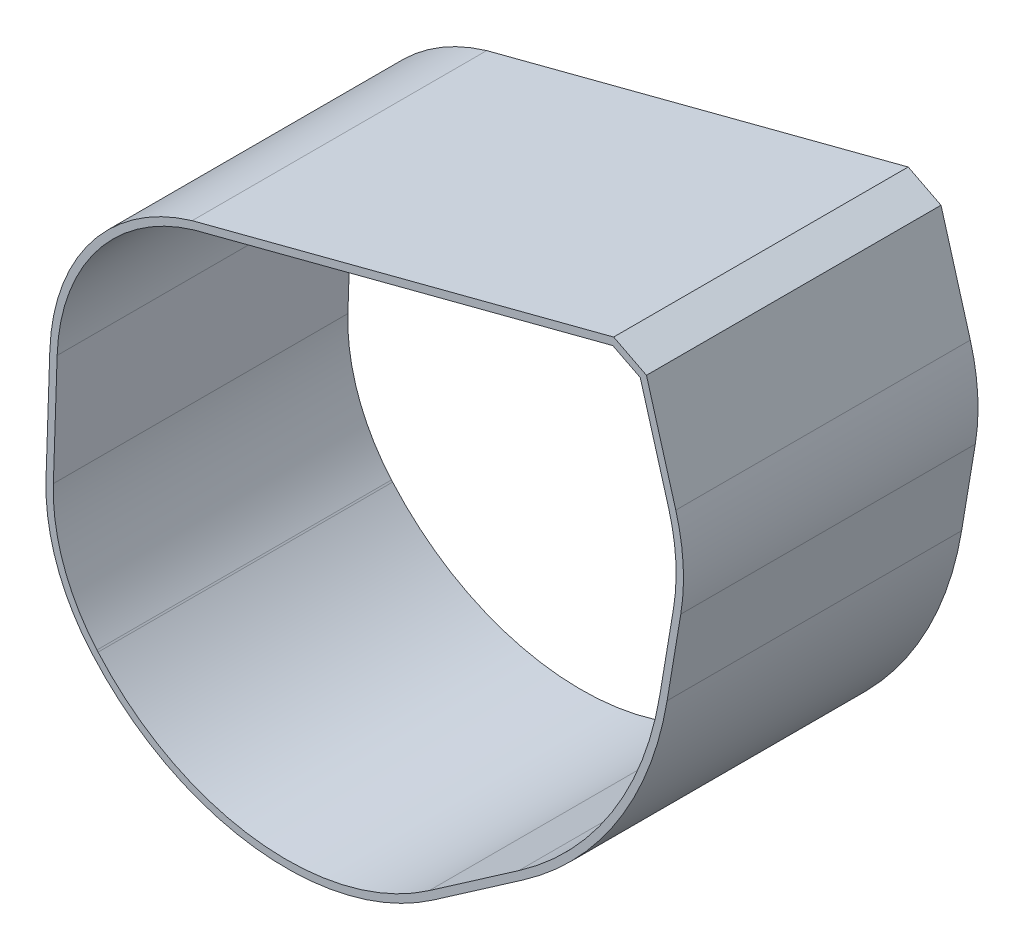
ISO-10303-21;
HEADER;
FILE_DESCRIPTION(('STEP AP214'),'2;1');
FILE_NAME('part.step','',(''),(''),'','','');
FILE_SCHEMA(('AUTOMOTIVE_DESIGN { 1 0 10303 214 1 1 1 1 }'));
ENDSEC;
DATA;
#1=APPLICATION_CONTEXT('core data for automotive mechanical design processes');
#2=APPLICATION_PROTOCOL_DEFINITION('international standard','automotive_design',2000,#1);
#3=PRODUCT_CONTEXT('',#1,'mechanical');
#4=PRODUCT('Part','Part','',(#3));
#5=PRODUCT_RELATED_PRODUCT_CATEGORY('part','',(#4));
#6=PRODUCT_DEFINITION_FORMATION('','',#4);
#7=PRODUCT_DEFINITION_CONTEXT('part definition',#1,'design');
#8=PRODUCT_DEFINITION('design','',#6,#7);
#9=PRODUCT_DEFINITION_SHAPE('','',#8);
#10=(LENGTH_UNIT() NAMED_UNIT(*) SI_UNIT(.MILLI.,.METRE.));
#11=(NAMED_UNIT(*) PLANE_ANGLE_UNIT() SI_UNIT($,.RADIAN.));
#12=(NAMED_UNIT(*) SI_UNIT($,.STERADIAN.) SOLID_ANGLE_UNIT());
#13=UNCERTAINTY_MEASURE_WITH_UNIT(LENGTH_MEASURE(1.E-05),#10,'distance_accuracy_value','');
#14=(GEOMETRIC_REPRESENTATION_CONTEXT(3) GLOBAL_UNCERTAINTY_ASSIGNED_CONTEXT((#13)) GLOBAL_UNIT_ASSIGNED_CONTEXT((#10,
#11,#12)) REPRESENTATION_CONTEXT('',''));
#15=CARTESIAN_POINT('',(0.,0.,0.));
#16=DIRECTION('',(0.,0.,1.));
#17=DIRECTION('',(1.,0.,0.));
#18=AXIS2_PLACEMENT_3D('',#15,#16,#17);
#19=CARTESIAN_POINT('',(71.229054664981,195.352203738938,101.6));
#20=DIRECTION('',(0.,0.,1.));
#21=DIRECTION('',(1.,0.,0.));
#22=AXIS2_PLACEMENT_3D('',#19,#20,#21);
#23=PLANE('',#22);
#24=CARTESIAN_POINT('',(71.229054664981,195.352203738938,101.6));
#25=DIRECTION('',(0.,0.,1.));
#26=DIRECTION('',(1.,0.,0.));
#27=AXIS2_PLACEMENT_3D('',#24,#25,#26);
#28=CIRCLE('',#27,68.58);
#29=CARTESIAN_POINT('',(51.7996605549198,261.122372086875,101.6));
#30=VERTEX_POINT('',#29);
#31=CARTESIAN_POINT('',(2.68786865894482,197.659197645725,101.6));
#32=VERTEX_POINT('',#31);
#33=EDGE_CURVE('E290',#30,#32,#28,.T.);
#34=ORIENTED_EDGE('',*,*,#33,.T.);
#35=DIRECTION('',(-0.0336394562086104,-0.999434033333861,0.));
#36=VECTOR('',#35,1.);
#37=CARTESIAN_POINT('',(1.37677554533085,158.706395600129,101.6));
#38=LINE('',#37,#36);
#39=CARTESIAN_POINT('',(1.37677554533083,158.706395600129,101.6));
#40=VERTEX_POINT('',#39);
#41=EDGE_CURVE('E293',#32,#40,#38,.T.);
#42=ORIENTED_EDGE('',*,*,#41,.T.);
#43=CARTESIAN_POINT('',(64.840836662031,156.570290130882,101.6));
#44=DIRECTION('',(0.,0.,1.));
#45=DIRECTION('',(-1.,0.,0.));
#46=AXIS2_PLACEMENT_3D('',#43,#44,#45);
#47=CIRCLE('',#46,63.5);
#48=CARTESIAN_POINT('',(17.0366550230462,114.773038811843,101.6));
#49=VERTEX_POINT('',#48);
#50=EDGE_CURVE('E296',#40,#49,#47,.T.);
#51=ORIENTED_EDGE('',*,*,#50,.T.);
#52=DIRECTION('',(0.658224430221118,-0.752821758094228,0.));
#53=VECTOR('',#52,1.);
#54=CARTESIAN_POINT('',(17.4314207231345,114.321538996991,101.6));
#55=LINE('',#54,#53);
#56=CARTESIAN_POINT('',(17.4314207231345,114.321538996991,101.6));
#57=VERTEX_POINT('',#56);
#58=EDGE_CURVE('E298',#49,#57,#55,.T.);
#59=ORIENTED_EDGE('',*,*,#58,.T.);
#60=CARTESIAN_POINT('',(84.3572750177134,172.837690843646,101.6));
#61=DIRECTION('',(0.,0.,1.));
#62=DIRECTION('',(-1.,0.,0.));
#63=AXIS2_PLACEMENT_3D('',#60,#61,#62);
#64=CIRCLE('',#63,88.9);
#65=CARTESIAN_POINT('',(135.007693070529,99.7778171024811,101.6));
#66=VERTEX_POINT('',#65);
#67=EDGE_CURVE('E300',#57,#66,#64,.T.);
#68=ORIENTED_EDGE('',*,*,#67,.T.);
#69=DIRECTION('',(0.821820851981611,0.569745984846071,0.));
#70=VECTOR('',#69,1.);
#71=CARTESIAN_POINT('',(165.895883474715,121.191757159504,101.6));
#72=LINE('',#71,#70);
#73=CARTESIAN_POINT('',(165.895883474715,121.191757159504,101.6));
#74=VERTEX_POINT('',#73);
#75=EDGE_CURVE('E302',#66,#74,#72,.T.);
#76=ORIENTED_EDGE('',*,*,#75,.T.);
#77=CARTESIAN_POINT('',(97.8796078037908,219.300730469069,101.6));
#78=DIRECTION('',(0.,0.,1.));
#79=DIRECTION('',(-1.,0.,0.));
#80=AXIS2_PLACEMENT_3D('',#77,#78,#79);
#81=CIRCLE('',#80,119.38);
#82=CARTESIAN_POINT('',(215.625776200021,199.617635488689,101.6));
#83=VERTEX_POINT('',#82);
#84=EDGE_CURVE('E304',#74,#83,#81,.T.);
#85=ORIENTED_EDGE('',*,*,#84,.T.);
#86=DIRECTION('',(0.164877659410121,0.986314025768386,0.));
#87=VECTOR('',#86,1.);
#88=CARTESIAN_POINT('',(220.342179316499,227.831612819533,101.6));
#89=LINE('',#88,#87);
#90=CARTESIAN_POINT('',(220.342179316499,227.831612819533,101.6));
#91=VERTEX_POINT('',#90);
#92=EDGE_CURVE('E306',#83,#91,#89,.T.);
#93=ORIENTED_EDGE('',*,*,#92,.T.);
#94=CARTESIAN_POINT('',(152.700763429303,239.138922701879,101.6));
#95=DIRECTION('',(0.,0.,1.));
#96=DIRECTION('',(-1.,0.,0.));
#97=AXIS2_PLACEMENT_3D('',#94,#95,#96);
#98=CIRCLE('',#97,68.58);
#99=CARTESIAN_POINT('',(218.620076974412,258.056123915102,101.6));
#100=VERTEX_POINT('',#99);
#101=EDGE_CURVE('E308',#91,#100,#98,.T.);
#102=ORIENTED_EDGE('',*,*,#101,.T.);
#103=DIRECTION('',(-0.275841370854804,0.96120317213633,0.));
#104=VECTOR('',#103,1.);
#105=CARTESIAN_POINT('',(208.509660321781,293.287113842441,101.6));
#106=LINE('',#105,#104);
#107=CARTESIAN_POINT('',(208.509660321781,293.287113842441,101.6));
#108=VERTEX_POINT('',#107);
#109=EDGE_CURVE('E310',#100,#108,#106,.T.);
#110=ORIENTED_EDGE('',*,*,#109,.T.);
#111=DIRECTION('',(-0.891406266207597,0.453205106508995,0.));
#112=VECTOR('',#111,1.);
#113=CARTESIAN_POINT('',(197.186615042477,299.043929938928,101.6));
#114=LINE('',#113,#112);
#115=CARTESIAN_POINT('',(197.186615042477,299.043929938928,101.6));
#116=VERTEX_POINT('',#115);
#117=EDGE_CURVE('E312',#108,#116,#114,.T.);
#118=ORIENTED_EDGE('',*,*,#117,.T.);
#119=DIRECTION('',(-0.967626169911023,-0.2523877875479,0.));
#120=VECTOR('',#119,1.);
#121=CARTESIAN_POINT('',(51.7996605549198,261.122372086875,101.6));
#122=LINE('',#121,#120);
#123=EDGE_CURVE('E314',#116,#30,#122,.T.);
#124=ORIENTED_EDGE('',*,*,#123,.T.);
#125=EDGE_LOOP('',(#34,#42,#51,#59,#68,#76,#85,#93,#102,#110,#118,#124));
#126=FACE_BOUND('',#125,.T.);
#127=DIRECTION('',(-0.967626169911023,-0.2523877875479,0.));
#128=VECTOR('',#127,1.);
#129=CARTESIAN_POINT('',(52.4805441545708,258.674987582046,101.6));
#130=LINE('',#129,#128);
#131=CARTESIAN_POINT('',(196.894837030832,296.342844242729,101.6));
#132=VERTEX_POINT('',#131);
#133=CARTESIAN_POINT('',(52.4805441545708,258.674987582046,101.6));
#134=VERTEX_POINT('',#133);
#135=EDGE_CURVE('E205',#132,#134,#130,.T.);
#136=ORIENTED_EDGE('',*,*,#135,.F.);
#137=DIRECTION('',(-0.891406266207596,0.453205106508998,0.));
#138=VECTOR('',#137,1.);
#139=CARTESIAN_POINT('',(196.894837030832,296.342844242729,101.6));
#140=LINE('',#139,#138);
#141=CARTESIAN_POINT('',(206.373128661955,291.523930206505,101.6));
#142=VERTEX_POINT('',#141);
#143=EDGE_CURVE('E197',#142,#132,#140,.T.);
#144=ORIENTED_EDGE('',*,*,#143,.F.);
#145=DIRECTION('',(-0.275841370854804,0.961203172136329,0.));
#146=VECTOR('',#145,1.);
#147=CARTESIAN_POINT('',(206.373128661955,291.523930206505,101.6));
#148=LINE('',#147,#146);
#149=CARTESIAN_POINT('',(216.178620917186,257.355486833131,101.6));
#150=VERTEX_POINT('',#149);
#151=EDGE_CURVE('E238',#150,#142,#148,.T.);
#152=ORIENTED_EDGE('',*,*,#151,.F.);
#153=CARTESIAN_POINT('',(152.700763429303,239.138922701879,101.6));
#154=DIRECTION('',(0.,0.,1.));
#155=DIRECTION('',(-1.,0.,0.));
#156=AXIS2_PLACEMENT_3D('',#153,#154,#155);
#157=CIRCLE('',#156,66.04);
#158=CARTESIAN_POINT('',(217.836941691047,228.250402074435,101.6));
#159=VERTEX_POINT('',#158);
#160=EDGE_CURVE('E236',#159,#150,#157,.T.);
#161=ORIENTED_EDGE('',*,*,#160,.F.);
#162=DIRECTION('',(0.164877659410121,0.986314025768386,0.));
#163=VECTOR('',#162,1.);
#164=CARTESIAN_POINT('',(217.836941691047,228.250402074435,101.6));
#165=LINE('',#164,#163);
#166=CARTESIAN_POINT('',(213.120538574569,200.036424743591,101.6));
#167=VERTEX_POINT('',#166);
#168=EDGE_CURVE('E234',#167,#159,#165,.T.);
#169=ORIENTED_EDGE('',*,*,#168,.F.);
#170=CARTESIAN_POINT('',(97.8796078037908,219.300730469069,101.6));
#171=DIRECTION('',(0.,0.,1.));
#172=DIRECTION('',(-1.,0.,0.));
#173=AXIS2_PLACEMENT_3D('',#170,#171,#172);
#174=CIRCLE('',#173,116.84);
#175=CARTESIAN_POINT('',(164.448728673206,123.279182123537,101.6));
#176=VERTEX_POINT('',#175);
#177=EDGE_CURVE('E232',#176,#167,#174,.T.);
#178=ORIENTED_EDGE('',*,*,#177,.F.);
#179=DIRECTION('',(0.821820851981611,0.569745984846071,0.));
#180=VECTOR('',#179,1.);
#181=CARTESIAN_POINT('',(164.448728673206,123.279182123537,101.6));
#182=LINE('',#181,#180);
#183=CARTESIAN_POINT('',(133.56053826902,101.865242066514,101.6));
#184=VERTEX_POINT('',#183);
#185=EDGE_CURVE('E230',#184,#176,#182,.T.);
#186=ORIENTED_EDGE('',*,*,#185,.F.);
#187=CARTESIAN_POINT('',(84.3572750177134,172.837690843646,101.6));
#188=DIRECTION('',(0.,0.,1.));
#189=DIRECTION('',(-1.,0.,0.));
#190=AXIS2_PLACEMENT_3D('',#187,#188,#189);
#191=CIRCLE('',#190,86.36);
#192=CARTESIAN_POINT('',(19.3435879886939,115.993429049753,101.6));
#193=VERTEX_POINT('',#192);
#194=EDGE_CURVE('E228',#193,#184,#191,.T.);
#195=ORIENTED_EDGE('',*,*,#194,.F.);
#196=DIRECTION('',(0.658224430221087,-0.752821758094255,0.));
#197=VECTOR('',#196,1.);
#198=CARTESIAN_POINT('',(19.3435879886939,115.993429049753,101.6));
#199=LINE('',#198,#197);
#200=CARTESIAN_POINT('',(18.9488222886056,116.444928864604,101.6));
#201=VERTEX_POINT('',#200);
#202=EDGE_CURVE('E226',#201,#193,#199,.T.);
#203=ORIENTED_EDGE('',*,*,#202,.F.);
#204=CARTESIAN_POINT('',(64.840836662031,156.570290130882,101.6));
#205=DIRECTION('',(0.,0.,1.));
#206=DIRECTION('',(-1.,0.,0.));
#207=AXIS2_PLACEMENT_3D('',#204,#205,#206);
#208=CIRCLE('',#207,60.96);
#209=CARTESIAN_POINT('',(3.91533798999884,158.62095138136,101.6));
#210=VERTEX_POINT('',#209);
#211=EDGE_CURVE('E224',#210,#201,#208,.T.);
#212=ORIENTED_EDGE('',*,*,#211,.F.);
#213=DIRECTION('',(-0.0336394562086107,-0.999434033333861,0.));
#214=VECTOR('',#213,1.);
#215=CARTESIAN_POINT('',(3.91533798999884,158.62095138136,101.6));
#216=LINE('',#215,#214);
#217=CARTESIAN_POINT('',(5.22643110361282,197.573753426955,101.6));
#218=VERTEX_POINT('',#217);
#219=EDGE_CURVE('E220',#218,#210,#216,.T.);
#220=ORIENTED_EDGE('',*,*,#219,.F.);
#221=CARTESIAN_POINT('',(71.229054664981,195.352203738938,101.6));
#222=DIRECTION('',(0.,0.,1.));
#223=DIRECTION('',(1.,0.,0.));
#224=AXIS2_PLACEMENT_3D('',#221,#222,#223);
#225=CIRCLE('',#224,66.04);
#226=EDGE_CURVE('E218',#134,#218,#225,.T.);
#227=ORIENTED_EDGE('',*,*,#226,.F.);
#228=EDGE_LOOP('',(#136,#144,#152,#161,#169,#178,#186,#195,#203,#212,#220,#227));
#229=FACE_BOUND('',#228,.T.);
#230=ADVANCED_FACE('F36',(#126,#229),#23,.T.);
#231=CARTESIAN_POINT('',(71.229054664981,195.352203738938,0.));
#232=DIRECTION('',(0.,0.,1.));
#233=DIRECTION('',(1.,0.,0.));
#234=AXIS2_PLACEMENT_3D('',#231,#232,#233);
#235=PLANE('',#234);
#236=CARTESIAN_POINT('',(71.229054664981,195.352203738938,0.));
#237=DIRECTION('',(0.,0.,1.));
#238=DIRECTION('',(1.,0.,0.));
#239=AXIS2_PLACEMENT_3D('',#236,#237,#238);
#240=CIRCLE('',#239,68.58);
#241=CARTESIAN_POINT('',(51.7996605549198,261.122372086875,0.));
#242=VERTEX_POINT('',#241);
#243=CARTESIAN_POINT('',(2.68786865894482,197.659197645725,0.));
#244=VERTEX_POINT('',#243);
#245=EDGE_CURVE('E213',#242,#244,#240,.T.);
#246=ORIENTED_EDGE('',*,*,#245,.F.);
#247=DIRECTION('',(-0.967626169911023,-0.2523877875479,0.));
#248=VECTOR('',#247,1.);
#249=CARTESIAN_POINT('',(51.7996605549198,261.122372086875,0.));
#250=LINE('',#249,#248);
#251=CARTESIAN_POINT('',(197.186615042477,299.043929938928,0.));
#252=VERTEX_POINT('',#251);
#253=EDGE_CURVE('E294',#252,#242,#250,.T.);
#254=ORIENTED_EDGE('',*,*,#253,.F.);
#255=DIRECTION('',(-0.891406266207597,0.453205106508995,0.));
#256=VECTOR('',#255,1.);
#257=CARTESIAN_POINT('',(197.186615042477,299.043929938928,0.));
#258=LINE('',#257,#256);
#259=CARTESIAN_POINT('',(208.509660321781,293.287113842441,0.));
#260=VERTEX_POINT('',#259);
#261=EDGE_CURVE('E337',#260,#252,#258,.T.);
#262=ORIENTED_EDGE('',*,*,#261,.F.);
#263=DIRECTION('',(-0.275841370854804,0.96120317213633,0.));
#264=VECTOR('',#263,1.);
#265=CARTESIAN_POINT('',(208.509660321781,293.287113842441,0.));
#266=LINE('',#265,#264);
#267=CARTESIAN_POINT('',(218.620076974412,258.056123915102,0.));
#268=VERTEX_POINT('',#267);
#269=EDGE_CURVE('E335',#268,#260,#266,.T.);
#270=ORIENTED_EDGE('',*,*,#269,.F.);
#271=CARTESIAN_POINT('',(152.700763429303,239.138922701879,0.));
#272=DIRECTION('',(0.,0.,1.));
#273=DIRECTION('',(-1.,0.,0.));
#274=AXIS2_PLACEMENT_3D('',#271,#272,#273);
#275=CIRCLE('',#274,68.58);
#276=CARTESIAN_POINT('',(220.342179316499,227.831612819533,0.));
#277=VERTEX_POINT('',#276);
#278=EDGE_CURVE('E333',#277,#268,#275,.T.);
#279=ORIENTED_EDGE('',*,*,#278,.F.);
#280=DIRECTION('',(0.164877659410121,0.986314025768386,0.));
#281=VECTOR('',#280,1.);
#282=CARTESIAN_POINT('',(220.342179316499,227.831612819533,0.));
#283=LINE('',#282,#281);
#284=CARTESIAN_POINT('',(215.625776200021,199.617635488689,0.));
#285=VERTEX_POINT('',#284);
#286=EDGE_CURVE('E331',#285,#277,#283,.T.);
#287=ORIENTED_EDGE('',*,*,#286,.F.);
#288=CARTESIAN_POINT('',(97.8796078037908,219.300730469069,0.));
#289=DIRECTION('',(0.,0.,1.));
#290=DIRECTION('',(-1.,0.,0.));
#291=AXIS2_PLACEMENT_3D('',#288,#289,#290);
#292=CIRCLE('',#291,119.38);
#293=CARTESIAN_POINT('',(165.895883474715,121.191757159504,0.));
#294=VERTEX_POINT('',#293);
#295=EDGE_CURVE('E329',#294,#285,#292,.T.);
#296=ORIENTED_EDGE('',*,*,#295,.F.);
#297=DIRECTION('',(0.821820851981611,0.569745984846071,0.));
#298=VECTOR('',#297,1.);
#299=CARTESIAN_POINT('',(165.895883474715,121.191757159504,0.));
#300=LINE('',#299,#298);
#301=CARTESIAN_POINT('',(135.007693070529,99.7778171024811,0.));
#302=VERTEX_POINT('',#301);
#303=EDGE_CURVE('E327',#302,#294,#300,.T.);
#304=ORIENTED_EDGE('',*,*,#303,.F.);
#305=CARTESIAN_POINT('',(84.3572750177134,172.837690843646,0.));
#306=DIRECTION('',(0.,0.,1.));
#307=DIRECTION('',(-1.,0.,0.));
#308=AXIS2_PLACEMENT_3D('',#305,#306,#307);
#309=CIRCLE('',#308,88.9);
#310=CARTESIAN_POINT('',(17.4314207231345,114.321538996991,0.));
#311=VERTEX_POINT('',#310);
#312=EDGE_CURVE('E325',#311,#302,#309,.T.);
#313=ORIENTED_EDGE('',*,*,#312,.F.);
#314=DIRECTION('',(0.658224430221118,-0.752821758094228,0.));
#315=VECTOR('',#314,1.);
#316=CARTESIAN_POINT('',(17.4314207231345,114.321538996991,0.));
#317=LINE('',#316,#315);
#318=CARTESIAN_POINT('',(17.0366550230462,114.773038811843,0.));
#319=VERTEX_POINT('',#318);
#320=EDGE_CURVE('E323',#319,#311,#317,.T.);
#321=ORIENTED_EDGE('',*,*,#320,.F.);
#322=CARTESIAN_POINT('',(64.840836662031,156.570290130882,0.));
#323=DIRECTION('',(0.,0.,1.));
#324=DIRECTION('',(-1.,0.,0.));
#325=AXIS2_PLACEMENT_3D('',#322,#323,#324);
#326=CIRCLE('',#325,63.5);
#327=CARTESIAN_POINT('',(1.37677554533083,158.706395600129,0.));
#328=VERTEX_POINT('',#327);
#329=EDGE_CURVE('E321',#328,#319,#326,.T.);
#330=ORIENTED_EDGE('',*,*,#329,.F.);
#331=DIRECTION('',(-0.0336394562086104,-0.999434033333861,0.));
#332=VECTOR('',#331,1.);
#333=CARTESIAN_POINT('',(1.37677554533085,158.706395600129,0.));
#334=LINE('',#333,#332);
#335=EDGE_CURVE('E319',#244,#328,#334,.T.);
#336=ORIENTED_EDGE('',*,*,#335,.F.);
#337=EDGE_LOOP('',(#246,#254,#262,#270,#279,#287,#296,#304,#313,#321,#330,#336));
#338=FACE_BOUND('',#337,.T.);
#339=DIRECTION('',(-0.891406266207596,0.453205106508998,0.));
#340=VECTOR('',#339,1.);
#341=CARTESIAN_POINT('',(196.894837030832,296.342844242729,0.));
#342=LINE('',#341,#340);
#343=CARTESIAN_POINT('',(206.373128661955,291.523930206505,0.));
#344=VERTEX_POINT('',#343);
#345=CARTESIAN_POINT('',(196.894837030832,296.342844242729,0.));
#346=VERTEX_POINT('',#345);
#347=EDGE_CURVE('E59',#344,#346,#342,.T.);
#348=ORIENTED_EDGE('',*,*,#347,.T.);
#349=DIRECTION('',(-0.967626169911023,-0.2523877875479,0.));
#350=VECTOR('',#349,1.);
#351=CARTESIAN_POINT('',(52.4805441545708,258.674987582046,0.));
#352=LINE('',#351,#350);
#353=CARTESIAN_POINT('',(52.4805441545708,258.674987582046,0.));
#354=VERTEX_POINT('',#353);
#355=EDGE_CURVE('E212',#346,#354,#352,.T.);
#356=ORIENTED_EDGE('',*,*,#355,.T.);
#357=CARTESIAN_POINT('',(71.229054664981,195.352203738938,0.));
#358=DIRECTION('',(0.,0.,1.));
#359=DIRECTION('',(1.,0.,0.));
#360=AXIS2_PLACEMENT_3D('',#357,#358,#359);
#361=CIRCLE('',#360,66.04);
#362=CARTESIAN_POINT('',(5.22643110361282,197.573753426955,0.));
#363=VERTEX_POINT('',#362);
#364=EDGE_CURVE('E242',#354,#363,#361,.T.);
#365=ORIENTED_EDGE('',*,*,#364,.T.);
#366=DIRECTION('',(-0.0336394562086107,-0.999434033333861,0.));
#367=VECTOR('',#366,1.);
#368=CARTESIAN_POINT('',(3.91533798999884,158.62095138136,0.));
#369=LINE('',#368,#367);
#370=CARTESIAN_POINT('',(3.91533798999884,158.62095138136,0.));
#371=VERTEX_POINT('',#370);
#372=EDGE_CURVE('E245',#363,#371,#369,.T.);
#373=ORIENTED_EDGE('',*,*,#372,.T.);
#374=CARTESIAN_POINT('',(64.840836662031,156.570290130882,0.));
#375=DIRECTION('',(0.,0.,1.));
#376=DIRECTION('',(-1.,0.,0.));
#377=AXIS2_PLACEMENT_3D('',#374,#375,#376);
#378=CIRCLE('',#377,60.96);
#379=CARTESIAN_POINT('',(18.9488222886056,116.444928864604,0.));
#380=VERTEX_POINT('',#379);
#381=EDGE_CURVE('E248',#371,#380,#378,.T.);
#382=ORIENTED_EDGE('',*,*,#381,.T.);
#383=DIRECTION('',(0.658224430221087,-0.752821758094255,0.));
#384=VECTOR('',#383,1.);
#385=CARTESIAN_POINT('',(19.3435879886939,115.993429049753,0.));
#386=LINE('',#385,#384);
#387=CARTESIAN_POINT('',(19.3435879886939,115.993429049753,0.));
#388=VERTEX_POINT('',#387);
#389=EDGE_CURVE('E251',#380,#388,#386,.T.);
#390=ORIENTED_EDGE('',*,*,#389,.T.);
#391=CARTESIAN_POINT('',(84.3572750177134,172.837690843646,0.));
#392=DIRECTION('',(0.,0.,1.));
#393=DIRECTION('',(-1.,0.,0.));
#394=AXIS2_PLACEMENT_3D('',#391,#392,#393);
#395=CIRCLE('',#394,86.36);
#396=CARTESIAN_POINT('',(133.56053826902,101.865242066514,0.));
#397=VERTEX_POINT('',#396);
#398=EDGE_CURVE('E254',#388,#397,#395,.T.);
#399=ORIENTED_EDGE('',*,*,#398,.T.);
#400=DIRECTION('',(0.821820851981611,0.569745984846071,0.));
#401=VECTOR('',#400,1.);
#402=CARTESIAN_POINT('',(164.448728673206,123.279182123537,0.));
#403=LINE('',#402,#401);
#404=CARTESIAN_POINT('',(164.448728673206,123.279182123537,0.));
#405=VERTEX_POINT('',#404);
#406=EDGE_CURVE('E257',#397,#405,#403,.T.);
#407=ORIENTED_EDGE('',*,*,#406,.T.);
#408=CARTESIAN_POINT('',(97.8796078037908,219.300730469069,0.));
#409=DIRECTION('',(0.,0.,1.));
#410=DIRECTION('',(-1.,0.,0.));
#411=AXIS2_PLACEMENT_3D('',#408,#409,#410);
#412=CIRCLE('',#411,116.84);
#413=CARTESIAN_POINT('',(213.120538574569,200.036424743591,0.));
#414=VERTEX_POINT('',#413);
#415=EDGE_CURVE('E260',#405,#414,#412,.T.);
#416=ORIENTED_EDGE('',*,*,#415,.T.);
#417=DIRECTION('',(0.164877659410121,0.986314025768386,0.));
#418=VECTOR('',#417,1.);
#419=CARTESIAN_POINT('',(217.836941691047,228.250402074435,0.));
#420=LINE('',#419,#418);
#421=CARTESIAN_POINT('',(217.836941691047,228.250402074435,0.));
#422=VERTEX_POINT('',#421);
#423=EDGE_CURVE('E263',#414,#422,#420,.T.);
#424=ORIENTED_EDGE('',*,*,#423,.T.);
#425=CARTESIAN_POINT('',(152.700763429303,239.138922701879,0.));
#426=DIRECTION('',(0.,0.,1.));
#427=DIRECTION('',(-1.,0.,0.));
#428=AXIS2_PLACEMENT_3D('',#425,#426,#427);
#429=CIRCLE('',#428,66.04);
#430=CARTESIAN_POINT('',(216.178620917186,257.355486833131,0.));
#431=VERTEX_POINT('',#430);
#432=EDGE_CURVE('E266',#422,#431,#429,.T.);
#433=ORIENTED_EDGE('',*,*,#432,.T.);
#434=DIRECTION('',(-0.275841370854804,0.961203172136329,0.));
#435=VECTOR('',#434,1.);
#436=CARTESIAN_POINT('',(206.373128661955,291.523930206505,0.));
#437=LINE('',#436,#435);
#438=EDGE_CURVE('E206',#431,#344,#437,.T.);
#439=ORIENTED_EDGE('',*,*,#438,.T.);
#440=EDGE_LOOP('',(#348,#356,#365,#373,#382,#390,#399,#407,#416,#424,#433,#439));
#441=FACE_BOUND('',#440,.T.);
#442=ADVANCED_FACE('F379',(#338,#441),#235,.F.);
#443=CARTESIAN_POINT('',(71.229054664981,195.352203738938,101.6));
#444=DIRECTION('',(0.,0.,-1.));
#445=DIRECTION('',(-1.,0.,0.));
#446=AXIS2_PLACEMENT_3D('',#443,#444,#445);
#447=CYLINDRICAL_SURFACE('',#446,68.58);
#448=ORIENTED_EDGE('',*,*,#245,.T.);
#449=DIRECTION('',(0.,0.,-1.));
#450=VECTOR('',#449,1.);
#451=CARTESIAN_POINT('',(2.68786865894482,197.659197645725,101.6));
#452=LINE('',#451,#450);
#453=EDGE_CURVE('E11',#32,#244,#452,.T.);
#454=ORIENTED_EDGE('',*,*,#453,.F.);
#455=ORIENTED_EDGE('',*,*,#33,.F.);
#456=DIRECTION('',(0.,0.,-1.));
#457=VECTOR('',#456,1.);
#458=CARTESIAN_POINT('',(51.7996605549198,261.122372086875,101.6));
#459=LINE('',#458,#457);
#460=EDGE_CURVE('E316',#30,#242,#459,.T.);
#461=ORIENTED_EDGE('',*,*,#460,.T.);
#462=EDGE_LOOP('',(#448,#454,#455,#461));
#463=FACE_BOUND('',#462,.T.);
#464=ADVANCED_FACE('F38',(#463),#447,.T.);
#465=CARTESIAN_POINT('',(1.37677554533085,158.706395600129,101.6));
#466=DIRECTION('',(0.999434033333861,-0.0336394562086104,0.));
#467=DIRECTION('',(0.0336394562086104,0.999434033333861,0.));
#468=AXIS2_PLACEMENT_3D('',#465,#466,#467);
#469=PLANE('',#468);
#470=ORIENTED_EDGE('',*,*,#335,.T.);
#471=DIRECTION('',(0.,0.,-1.));
#472=VECTOR('',#471,1.);
#473=CARTESIAN_POINT('',(1.37677554533083,158.706395600129,101.6));
#474=LINE('',#473,#472);
#475=EDGE_CURVE('E44',#40,#328,#474,.T.);
#476=ORIENTED_EDGE('',*,*,#475,.F.);
#477=ORIENTED_EDGE('',*,*,#41,.F.);
#478=ORIENTED_EDGE('',*,*,#453,.T.);
#479=EDGE_LOOP('',(#470,#476,#477,#478));
#480=FACE_BOUND('',#479,.T.);
#481=ADVANCED_FACE('F396',(#480),#469,.F.);
#482=CARTESIAN_POINT('',(64.840836662031,156.570290130882,101.6));
#483=DIRECTION('',(0.,0.,-1.));
#484=DIRECTION('',(-1.,0.,0.));
#485=AXIS2_PLACEMENT_3D('',#482,#483,#484);
#486=CYLINDRICAL_SURFACE('',#485,63.5);
#487=ORIENTED_EDGE('',*,*,#329,.T.);
#488=DIRECTION('',(0.,0.,-1.));
#489=VECTOR('',#488,1.);
#490=CARTESIAN_POINT('',(17.0366550230462,114.773038811843,101.6));
#491=LINE('',#490,#489);
#492=EDGE_CURVE('E366',#49,#319,#491,.T.);
#493=ORIENTED_EDGE('',*,*,#492,.F.);
#494=ORIENTED_EDGE('',*,*,#50,.F.);
#495=ORIENTED_EDGE('',*,*,#475,.T.);
#496=EDGE_LOOP('',(#487,#493,#494,#495));
#497=FACE_BOUND('',#496,.T.);
#498=ADVANCED_FACE('F373',(#497),#486,.T.);
#499=CARTESIAN_POINT('',(17.4314207231345,114.321538996991,101.6));
#500=DIRECTION('',(0.752821758094228,0.658224430221118,0.));
#501=DIRECTION('',(-0.658224430221119,0.752821758094228,0.));
#502=AXIS2_PLACEMENT_3D('',#499,#500,#501);
#503=PLANE('',#502);
#504=ORIENTED_EDGE('',*,*,#320,.T.);
#505=DIRECTION('',(0.,0.,-1.));
#506=VECTOR('',#505,1.);
#507=CARTESIAN_POINT('',(17.4314207231345,114.321538996991,101.6));
#508=LINE('',#507,#506);
#509=EDGE_CURVE('E363',#57,#311,#508,.T.);
#510=ORIENTED_EDGE('',*,*,#509,.F.);
#511=ORIENTED_EDGE('',*,*,#58,.F.);
#512=ORIENTED_EDGE('',*,*,#492,.T.);
#513=EDGE_LOOP('',(#504,#510,#511,#512));
#514=FACE_BOUND('',#513,.T.);
#515=ADVANCED_FACE('F385',(#514),#503,.F.);
#516=CARTESIAN_POINT('',(84.3572750177134,172.837690843646,101.6));
#517=DIRECTION('',(0.,0.,-1.));
#518=DIRECTION('',(-1.,0.,0.));
#519=AXIS2_PLACEMENT_3D('',#516,#517,#518);
#520=CYLINDRICAL_SURFACE('',#519,88.9);
#521=ORIENTED_EDGE('',*,*,#312,.T.);
#522=DIRECTION('',(0.,0.,-1.));
#523=VECTOR('',#522,1.);
#524=CARTESIAN_POINT('',(135.007693070529,99.7778171024811,101.6));
#525=LINE('',#524,#523);
#526=EDGE_CURVE('E360',#66,#302,#525,.T.);
#527=ORIENTED_EDGE('',*,*,#526,.F.);
#528=ORIENTED_EDGE('',*,*,#67,.F.);
#529=ORIENTED_EDGE('',*,*,#509,.T.);
#530=EDGE_LOOP('',(#521,#527,#528,#529));
#531=FACE_BOUND('',#530,.T.);
#532=ADVANCED_FACE('F389',(#531),#520,.T.);
#533=CARTESIAN_POINT('',(165.895883474715,121.191757159504,101.6));
#534=DIRECTION('',(-0.569745984846071,0.821820851981611,0.));
#535=DIRECTION('',(-0.821820851981611,-0.569745984846071,0.));
#536=AXIS2_PLACEMENT_3D('',#533,#534,#535);
#537=PLANE('',#536);
#538=ORIENTED_EDGE('',*,*,#303,.T.);
#539=DIRECTION('',(0.,0.,-1.));
#540=VECTOR('',#539,1.);
#541=CARTESIAN_POINT('',(165.895883474715,121.191757159504,101.6));
#542=LINE('',#541,#540);
#543=EDGE_CURVE('E357',#74,#294,#542,.T.);
#544=ORIENTED_EDGE('',*,*,#543,.F.);
#545=ORIENTED_EDGE('',*,*,#75,.F.);
#546=ORIENTED_EDGE('',*,*,#526,.T.);
#547=EDGE_LOOP('',(#538,#544,#545,#546));
#548=FACE_BOUND('',#547,.T.);
#549=ADVANCED_FACE('F429',(#548),#537,.F.);
#550=CARTESIAN_POINT('',(97.8796078037908,219.300730469069,101.6));
#551=DIRECTION('',(0.,0.,-1.));
#552=DIRECTION('',(-1.,0.,0.));
#553=AXIS2_PLACEMENT_3D('',#550,#551,#552);
#554=CYLINDRICAL_SURFACE('',#553,119.38);
#555=ORIENTED_EDGE('',*,*,#295,.T.);
#556=DIRECTION('',(0.,0.,-1.));
#557=VECTOR('',#556,1.);
#558=CARTESIAN_POINT('',(215.625776200021,199.617635488689,101.6));
#559=LINE('',#558,#557);
#560=EDGE_CURVE('E354',#83,#285,#559,.T.);
#561=ORIENTED_EDGE('',*,*,#560,.F.);
#562=ORIENTED_EDGE('',*,*,#84,.F.);
#563=ORIENTED_EDGE('',*,*,#543,.T.);
#564=EDGE_LOOP('',(#555,#561,#562,#563));
#565=FACE_BOUND('',#564,.T.);
#566=ADVANCED_FACE('F427',(#565),#554,.T.);
#567=CARTESIAN_POINT('',(220.342179316499,227.831612819533,101.6));
#568=DIRECTION('',(-0.986314025768386,0.164877659410121,0.));
#569=DIRECTION('',(-0.164877659410121,-0.986314025768386,0.));
#570=AXIS2_PLACEMENT_3D('',#567,#568,#569);
#571=PLANE('',#570);
#572=ORIENTED_EDGE('',*,*,#286,.T.);
#573=DIRECTION('',(0.,0.,-1.));
#574=VECTOR('',#573,1.);
#575=CARTESIAN_POINT('',(220.342179316499,227.831612819533,101.6));
#576=LINE('',#575,#574);
#577=EDGE_CURVE('E351',#91,#277,#576,.T.);
#578=ORIENTED_EDGE('',*,*,#577,.F.);
#579=ORIENTED_EDGE('',*,*,#92,.F.);
#580=ORIENTED_EDGE('',*,*,#560,.T.);
#581=EDGE_LOOP('',(#572,#578,#579,#580));
#582=FACE_BOUND('',#581,.T.);
#583=ADVANCED_FACE('F423',(#582),#571,.F.);
#584=CARTESIAN_POINT('',(152.700763429303,239.138922701879,101.6));
#585=DIRECTION('',(0.,0.,-1.));
#586=DIRECTION('',(-1.,0.,0.));
#587=AXIS2_PLACEMENT_3D('',#584,#585,#586);
#588=CYLINDRICAL_SURFACE('',#587,68.58);
#589=ORIENTED_EDGE('',*,*,#278,.T.);
#590=DIRECTION('',(0.,0.,-1.));
#591=VECTOR('',#590,1.);
#592=CARTESIAN_POINT('',(218.620076974412,258.056123915102,101.6));
#593=LINE('',#592,#591);
#594=EDGE_CURVE('E348',#100,#268,#593,.T.);
#595=ORIENTED_EDGE('',*,*,#594,.F.);
#596=ORIENTED_EDGE('',*,*,#101,.F.);
#597=ORIENTED_EDGE('',*,*,#577,.T.);
#598=EDGE_LOOP('',(#589,#595,#596,#597));
#599=FACE_BOUND('',#598,.T.);
#600=ADVANCED_FACE('F418',(#599),#588,.T.);
#601=CARTESIAN_POINT('',(208.509660321781,293.287113842441,101.6));
#602=DIRECTION('',(-0.96120317213633,-0.275841370854804,0.));
#603=DIRECTION('',(0.275841370854804,-0.96120317213633,0.));
#604=AXIS2_PLACEMENT_3D('',#601,#602,#603);
#605=PLANE('',#604);
#606=ORIENTED_EDGE('',*,*,#269,.T.);
#607=DIRECTION('',(0.,0.,-1.));
#608=VECTOR('',#607,1.);
#609=CARTESIAN_POINT('',(208.509660321781,293.287113842441,101.6));
#610=LINE('',#609,#608);
#611=EDGE_CURVE('E345',#108,#260,#610,.T.);
#612=ORIENTED_EDGE('',*,*,#611,.F.);
#613=ORIENTED_EDGE('',*,*,#109,.F.);
#614=ORIENTED_EDGE('',*,*,#594,.T.);
#615=EDGE_LOOP('',(#606,#612,#613,#614));
#616=FACE_BOUND('',#615,.T.);
#617=ADVANCED_FACE('F412',(#616),#605,.F.);
#618=CARTESIAN_POINT('',(197.186615042477,299.043929938928,101.6));
#619=DIRECTION('',(-0.453205106508995,-0.891406266207597,0.));
#620=DIRECTION('',(0.891406266207597,-0.453205106508995,0.));
#621=AXIS2_PLACEMENT_3D('',#618,#619,#620);
#622=PLANE('',#621);
#623=ORIENTED_EDGE('',*,*,#261,.T.);
#624=DIRECTION('',(0.,0.,-1.));
#625=VECTOR('',#624,1.);
#626=CARTESIAN_POINT('',(197.186615042477,299.043929938928,101.6));
#627=LINE('',#626,#625);
#628=EDGE_CURVE('E342',#116,#252,#627,.T.);
#629=ORIENTED_EDGE('',*,*,#628,.F.);
#630=ORIENTED_EDGE('',*,*,#117,.F.);
#631=ORIENTED_EDGE('',*,*,#611,.T.);
#632=EDGE_LOOP('',(#623,#629,#630,#631));
#633=FACE_BOUND('',#632,.T.);
#634=ADVANCED_FACE('F408',(#633),#622,.F.);
#635=CARTESIAN_POINT('',(51.7996605549198,261.122372086875,101.6));
#636=DIRECTION('',(0.2523877875479,-0.967626169911023,0.));
#637=DIRECTION('',(0.967626169911023,0.2523877875479,0.));
#638=AXIS2_PLACEMENT_3D('',#635,#636,#637);
#639=PLANE('',#638);
#640=ORIENTED_EDGE('',*,*,#253,.T.);
#641=ORIENTED_EDGE('',*,*,#460,.F.);
#642=ORIENTED_EDGE('',*,*,#123,.F.);
#643=ORIENTED_EDGE('',*,*,#628,.T.);
#644=EDGE_LOOP('',(#640,#641,#642,#643));
#645=FACE_BOUND('',#644,.T.);
#646=ADVANCED_FACE('F403',(#645),#639,.F.);
#647=CARTESIAN_POINT('',(196.894837030832,296.342844242729,101.6));
#648=DIRECTION('',(-0.453205106508998,-0.891406266207596,0.));
#649=DIRECTION('',(0.891406266207596,-0.453205106508998,0.));
#650=AXIS2_PLACEMENT_3D('',#647,#648,#649);
#651=PLANE('',#650);
#652=ORIENTED_EDGE('',*,*,#347,.F.);
#653=DIRECTION('',(0.,0.,-1.));
#654=VECTOR('',#653,1.);
#655=CARTESIAN_POINT('',(206.373128661955,291.523930206505,101.6));
#656=LINE('',#655,#654);
#657=EDGE_CURVE('E201',#142,#344,#656,.T.);
#658=ORIENTED_EDGE('',*,*,#657,.F.);
#659=ORIENTED_EDGE('',*,*,#143,.T.);
#660=DIRECTION('',(0.,0.,-1.));
#661=VECTOR('',#660,1.);
#662=CARTESIAN_POINT('',(196.894837030832,296.342844242729,101.6));
#663=LINE('',#662,#661);
#664=EDGE_CURVE('E200',#132,#346,#663,.T.);
#665=ORIENTED_EDGE('',*,*,#664,.T.);
#666=EDGE_LOOP('',(#652,#658,#659,#665));
#667=FACE_BOUND('',#666,.T.);
#668=ADVANCED_FACE('F199',(#667),#651,.T.);
#669=CARTESIAN_POINT('',(52.4805441545708,258.674987582046,101.6));
#670=DIRECTION('',(0.2523877875479,-0.967626169911023,0.));
#671=DIRECTION('',(0.967626169911023,0.2523877875479,0.));
#672=AXIS2_PLACEMENT_3D('',#669,#670,#671);
#673=PLANE('',#672);
#674=ORIENTED_EDGE('',*,*,#355,.F.);
#675=ORIENTED_EDGE('',*,*,#664,.F.);
#676=ORIENTED_EDGE('',*,*,#135,.T.);
#677=DIRECTION('',(0.,0.,-1.));
#678=VECTOR('',#677,1.);
#679=CARTESIAN_POINT('',(52.4805441545708,258.674987582046,101.6));
#680=LINE('',#679,#678);
#681=EDGE_CURVE('E214',#134,#354,#680,.T.);
#682=ORIENTED_EDGE('',*,*,#681,.T.);
#683=EDGE_LOOP('',(#674,#675,#676,#682));
#684=FACE_BOUND('',#683,.T.);
#685=ADVANCED_FACE('F209',(#684),#673,.T.);
#686=CARTESIAN_POINT('',(71.229054664981,195.352203738938,101.6));
#687=DIRECTION('',(0.,0.,-1.));
#688=DIRECTION('',(-1.,0.,0.));
#689=AXIS2_PLACEMENT_3D('',#686,#687,#688);
#690=CYLINDRICAL_SURFACE('',#689,66.04);
#691=ORIENTED_EDGE('',*,*,#364,.F.);
#692=ORIENTED_EDGE('',*,*,#681,.F.);
#693=ORIENTED_EDGE('',*,*,#226,.T.);
#694=DIRECTION('',(0.,0.,-1.));
#695=VECTOR('',#694,1.);
#696=CARTESIAN_POINT('',(5.22643110361282,197.573753426955,101.6));
#697=LINE('',#696,#695);
#698=EDGE_CURVE('E287',#218,#363,#697,.T.);
#699=ORIENTED_EDGE('',*,*,#698,.T.);
#700=EDGE_LOOP('',(#691,#692,#693,#699));
#701=FACE_BOUND('',#700,.T.);
#702=ADVANCED_FACE('F487',(#701),#690,.F.);
#703=CARTESIAN_POINT('',(3.91533798999884,158.62095138136,101.6));
#704=DIRECTION('',(0.999434033333861,-0.0336394562086107,0.));
#705=DIRECTION('',(0.0336394562086107,0.999434033333861,0.));
#706=AXIS2_PLACEMENT_3D('',#703,#704,#705);
#707=PLANE('',#706);
#708=ORIENTED_EDGE('',*,*,#372,.F.);
#709=ORIENTED_EDGE('',*,*,#698,.F.);
#710=ORIENTED_EDGE('',*,*,#219,.T.);
#711=DIRECTION('',(0.,0.,-1.));
#712=VECTOR('',#711,1.);
#713=CARTESIAN_POINT('',(3.91533798999884,158.62095138136,101.6));
#714=LINE('',#713,#712);
#715=EDGE_CURVE('E285',#210,#371,#714,.T.);
#716=ORIENTED_EDGE('',*,*,#715,.T.);
#717=EDGE_LOOP('',(#708,#709,#710,#716));
#718=FACE_BOUND('',#717,.T.);
#719=ADVANCED_FACE('F493',(#718),#707,.T.);
#720=CARTESIAN_POINT('',(64.840836662031,156.570290130882,101.6));
#721=DIRECTION('',(0.,0.,-1.));
#722=DIRECTION('',(-1.,0.,0.));
#723=AXIS2_PLACEMENT_3D('',#720,#721,#722);
#724=CYLINDRICAL_SURFACE('',#723,60.96);
#725=ORIENTED_EDGE('',*,*,#381,.F.);
#726=ORIENTED_EDGE('',*,*,#715,.F.);
#727=ORIENTED_EDGE('',*,*,#211,.T.);
#728=DIRECTION('',(0.,0.,-1.));
#729=VECTOR('',#728,1.);
#730=CARTESIAN_POINT('',(18.9488222886056,116.444928864604,101.6));
#731=LINE('',#730,#729);
#732=EDGE_CURVE('E283',#201,#380,#731,.T.);
#733=ORIENTED_EDGE('',*,*,#732,.T.);
#734=EDGE_LOOP('',(#725,#726,#727,#733));
#735=FACE_BOUND('',#734,.T.);
#736=ADVANCED_FACE('F501',(#735),#724,.F.);
#737=CARTESIAN_POINT('',(19.3435879886939,115.993429049753,101.6));
#738=DIRECTION('',(0.752821758094255,0.658224430221087,0.));
#739=DIRECTION('',(-0.658224430221087,0.752821758094255,0.));
#740=AXIS2_PLACEMENT_3D('',#737,#738,#739);
#741=PLANE('',#740);
#742=ORIENTED_EDGE('',*,*,#389,.F.);
#743=ORIENTED_EDGE('',*,*,#732,.F.);
#744=ORIENTED_EDGE('',*,*,#202,.T.);
#745=DIRECTION('',(0.,0.,-1.));
#746=VECTOR('',#745,1.);
#747=CARTESIAN_POINT('',(19.3435879886939,115.993429049753,101.6));
#748=LINE('',#747,#746);
#749=EDGE_CURVE('E281',#193,#388,#748,.T.);
#750=ORIENTED_EDGE('',*,*,#749,.T.);
#751=EDGE_LOOP('',(#742,#743,#744,#750));
#752=FACE_BOUND('',#751,.T.);
#753=ADVANCED_FACE('F509',(#752),#741,.T.);
#754=CARTESIAN_POINT('',(84.3572750177134,172.837690843646,101.6));
#755=DIRECTION('',(0.,0.,-1.));
#756=DIRECTION('',(-1.,0.,0.));
#757=AXIS2_PLACEMENT_3D('',#754,#755,#756);
#758=CYLINDRICAL_SURFACE('',#757,86.36);
#759=ORIENTED_EDGE('',*,*,#398,.F.);
#760=ORIENTED_EDGE('',*,*,#749,.F.);
#761=ORIENTED_EDGE('',*,*,#194,.T.);
#762=DIRECTION('',(0.,0.,-1.));
#763=VECTOR('',#762,1.);
#764=CARTESIAN_POINT('',(133.56053826902,101.865242066514,101.6));
#765=LINE('',#764,#763);
#766=EDGE_CURVE('E279',#184,#397,#765,.T.);
#767=ORIENTED_EDGE('',*,*,#766,.T.);
#768=EDGE_LOOP('',(#759,#760,#761,#767));
#769=FACE_BOUND('',#768,.T.);
#770=ADVANCED_FACE('F517',(#769),#758,.F.);
#771=CARTESIAN_POINT('',(164.448728673206,123.279182123537,101.6));
#772=DIRECTION('',(-0.569745984846071,0.821820851981611,0.));
#773=DIRECTION('',(-0.821820851981611,-0.569745984846071,0.));
#774=AXIS2_PLACEMENT_3D('',#771,#772,#773);
#775=PLANE('',#774);
#776=ORIENTED_EDGE('',*,*,#406,.F.);
#777=ORIENTED_EDGE('',*,*,#766,.F.);
#778=ORIENTED_EDGE('',*,*,#185,.T.);
#779=DIRECTION('',(0.,0.,-1.));
#780=VECTOR('',#779,1.);
#781=CARTESIAN_POINT('',(164.448728673206,123.279182123537,101.6));
#782=LINE('',#781,#780);
#783=EDGE_CURVE('E277',#176,#405,#782,.T.);
#784=ORIENTED_EDGE('',*,*,#783,.T.);
#785=EDGE_LOOP('',(#776,#777,#778,#784));
#786=FACE_BOUND('',#785,.T.);
#787=ADVANCED_FACE('F525',(#786),#775,.T.);
#788=CARTESIAN_POINT('',(97.8796078037908,219.300730469069,101.6));
#789=DIRECTION('',(0.,0.,-1.));
#790=DIRECTION('',(-1.,0.,0.));
#791=AXIS2_PLACEMENT_3D('',#788,#789,#790);
#792=CYLINDRICAL_SURFACE('',#791,116.84);
#793=ORIENTED_EDGE('',*,*,#415,.F.);
#794=ORIENTED_EDGE('',*,*,#783,.F.);
#795=ORIENTED_EDGE('',*,*,#177,.T.);
#796=DIRECTION('',(0.,0.,-1.));
#797=VECTOR('',#796,1.);
#798=CARTESIAN_POINT('',(213.120538574569,200.036424743591,101.6));
#799=LINE('',#798,#797);
#800=EDGE_CURVE('E275',#167,#414,#799,.T.);
#801=ORIENTED_EDGE('',*,*,#800,.T.);
#802=EDGE_LOOP('',(#793,#794,#795,#801));
#803=FACE_BOUND('',#802,.T.);
#804=ADVANCED_FACE('F533',(#803),#792,.F.);
#805=CARTESIAN_POINT('',(217.836941691047,228.250402074435,101.6));
#806=DIRECTION('',(-0.986314025768386,0.164877659410121,0.));
#807=DIRECTION('',(-0.164877659410121,-0.986314025768386,0.));
#808=AXIS2_PLACEMENT_3D('',#805,#806,#807);
#809=PLANE('',#808);
#810=ORIENTED_EDGE('',*,*,#423,.F.);
#811=ORIENTED_EDGE('',*,*,#800,.F.);
#812=ORIENTED_EDGE('',*,*,#168,.T.);
#813=DIRECTION('',(0.,0.,-1.));
#814=VECTOR('',#813,1.);
#815=CARTESIAN_POINT('',(217.836941691047,228.250402074435,101.6));
#816=LINE('',#815,#814);
#817=EDGE_CURVE('E273',#159,#422,#816,.T.);
#818=ORIENTED_EDGE('',*,*,#817,.T.);
#819=EDGE_LOOP('',(#810,#811,#812,#818));
#820=FACE_BOUND('',#819,.T.);
#821=ADVANCED_FACE('F541',(#820),#809,.T.);
#822=CARTESIAN_POINT('',(152.700763429303,239.138922701879,101.6));
#823=DIRECTION('',(0.,0.,-1.));
#824=DIRECTION('',(-1.,0.,0.));
#825=AXIS2_PLACEMENT_3D('',#822,#823,#824);
#826=CYLINDRICAL_SURFACE('',#825,66.04);
#827=ORIENTED_EDGE('',*,*,#432,.F.);
#828=ORIENTED_EDGE('',*,*,#817,.F.);
#829=ORIENTED_EDGE('',*,*,#160,.T.);
#830=DIRECTION('',(0.,0.,-1.));
#831=VECTOR('',#830,1.);
#832=CARTESIAN_POINT('',(216.178620917186,257.355486833131,101.6));
#833=LINE('',#832,#831);
#834=EDGE_CURVE('E51',#150,#431,#833,.T.);
#835=ORIENTED_EDGE('',*,*,#834,.T.);
#836=EDGE_LOOP('',(#827,#828,#829,#835));
#837=FACE_BOUND('',#836,.T.);
#838=ADVANCED_FACE('F549',(#837),#826,.F.);
#839=CARTESIAN_POINT('',(206.373128661955,291.523930206505,101.6));
#840=DIRECTION('',(-0.96120317213633,-0.275841370854804,0.));
#841=DIRECTION('',(0.275841370854804,-0.96120317213633,0.));
#842=AXIS2_PLACEMENT_3D('',#839,#840,#841);
#843=PLANE('',#842);
#844=ORIENTED_EDGE('',*,*,#438,.F.);
#845=ORIENTED_EDGE('',*,*,#834,.F.);
#846=ORIENTED_EDGE('',*,*,#151,.T.);
#847=ORIENTED_EDGE('',*,*,#657,.T.);
#848=EDGE_LOOP('',(#844,#845,#846,#847));
#849=FACE_BOUND('',#848,.T.);
#850=ADVANCED_FACE('F557',(#849),#843,.T.);
#851=CLOSED_SHELL('',(#230,#442,#464,#481,#498,#515,#532,#549,#566,#583,#600,#617,#634,#646,
#668,#685,#702,#719,#736,#753,#770,#787,#804,#821,#838,#850));
#852=MANIFOLD_SOLID_BREP('B2',#851);
#853=ADVANCED_BREP_SHAPE_REPRESENTATION('',(#18,#852),#14);
#854=SHAPE_DEFINITION_REPRESENTATION(#9,#853);
ENDSEC;
END-ISO-10303-21;
